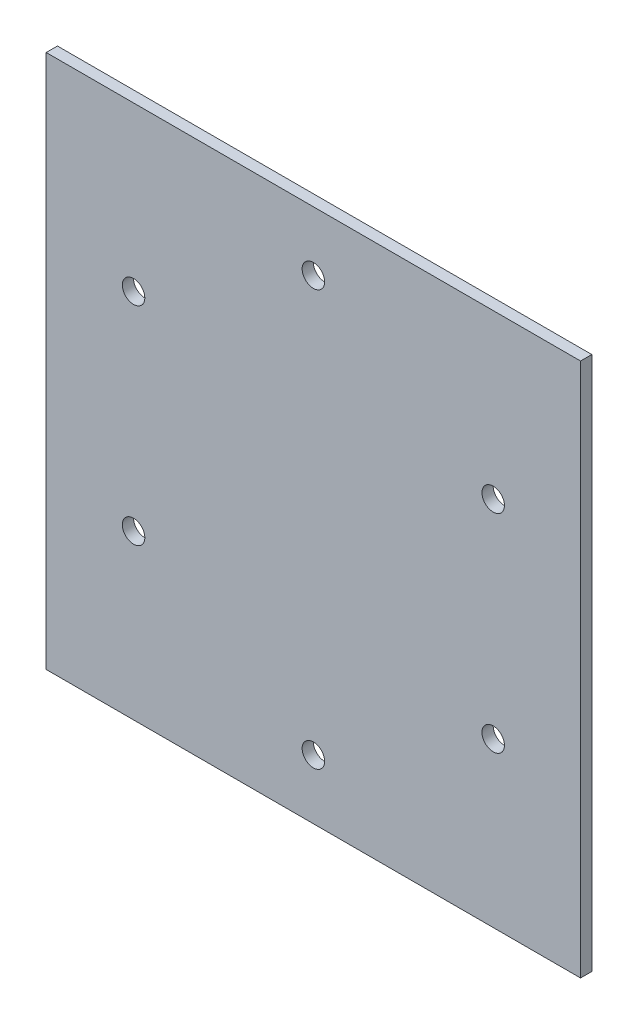
ISO-10303-21;
HEADER;
FILE_DESCRIPTION(('STEP AP214'),'2;1');
FILE_NAME('part.step','',(''),(''),'','','');
FILE_SCHEMA(('AUTOMOTIVE_DESIGN { 1 0 10303 214 1 1 1 1 }'));
ENDSEC;
DATA;
#1=APPLICATION_CONTEXT('core data for automotive mechanical design processes');
#2=APPLICATION_PROTOCOL_DEFINITION('international standard','automotive_design',2000,#1);
#3=PRODUCT_CONTEXT('',#1,'mechanical');
#4=PRODUCT('Part','Part','',(#3));
#5=PRODUCT_RELATED_PRODUCT_CATEGORY('part','',(#4));
#6=PRODUCT_DEFINITION_FORMATION('','',#4);
#7=PRODUCT_DEFINITION_CONTEXT('part definition',#1,'design');
#8=PRODUCT_DEFINITION('design','',#6,#7);
#9=PRODUCT_DEFINITION_SHAPE('','',#8);
#10=(LENGTH_UNIT() NAMED_UNIT(*) SI_UNIT(.MILLI.,.METRE.));
#11=(NAMED_UNIT(*) PLANE_ANGLE_UNIT() SI_UNIT($,.RADIAN.));
#12=(NAMED_UNIT(*) SI_UNIT($,.STERADIAN.) SOLID_ANGLE_UNIT());
#13=UNCERTAINTY_MEASURE_WITH_UNIT(LENGTH_MEASURE(1.E-05),#10,'distance_accuracy_value','');
#14=(GEOMETRIC_REPRESENTATION_CONTEXT(3) GLOBAL_UNCERTAINTY_ASSIGNED_CONTEXT((#13)) GLOBAL_UNIT_ASSIGNED_CONTEXT((#10,
#11,#12)) REPRESENTATION_CONTEXT('',''));
#15=CARTESIAN_POINT('',(0.,0.,0.));
#16=DIRECTION('',(0.,0.,1.));
#17=DIRECTION('',(1.,0.,0.));
#18=AXIS2_PLACEMENT_3D('',#15,#16,#17);
#19=CARTESIAN_POINT('',(0.,0.,2.));
#20=DIRECTION('',(1.,0.,0.));
#21=DIRECTION('',(0.,0.,-1.));
#22=AXIS2_PLACEMENT_3D('',#19,#20,#21);
#23=PLANE('',#22);
#24=DIRECTION('',(0.,-1.,0.));
#25=VECTOR('',#24,1.);
#26=CARTESIAN_POINT('',(0.,0.,-2.));
#27=LINE('',#26,#25);
#28=CARTESIAN_POINT('',(0.,190.,-2.));
#29=VERTEX_POINT('',#28);
#30=CARTESIAN_POINT('',(0.,0.,-2.));
#31=VERTEX_POINT('',#30);
#32=EDGE_CURVE('E102',#29,#31,#27,.T.);
#33=ORIENTED_EDGE('',*,*,#32,.T.);
#34=DIRECTION('',(0.,0.,-1.));
#35=VECTOR('',#34,1.);
#36=CARTESIAN_POINT('',(0.,0.,2.));
#37=LINE('',#36,#35);
#38=CARTESIAN_POINT('',(0.,0.,2.));
#39=VERTEX_POINT('',#38);
#40=EDGE_CURVE('E11',#39,#31,#37,.T.);
#41=ORIENTED_EDGE('',*,*,#40,.F.);
#42=DIRECTION('',(0.,-1.,0.));
#43=VECTOR('',#42,1.);
#44=CARTESIAN_POINT('',(0.,0.,2.));
#45=LINE('',#44,#43);
#46=CARTESIAN_POINT('',(0.,190.,2.));
#47=VERTEX_POINT('',#46);
#48=EDGE_CURVE('E90',#47,#39,#45,.T.);
#49=ORIENTED_EDGE('',*,*,#48,.F.);
#50=DIRECTION('',(0.,0.,-1.));
#51=VECTOR('',#50,1.);
#52=CARTESIAN_POINT('',(0.,190.,2.));
#53=LINE('',#52,#51);
#54=EDGE_CURVE('E98',#47,#29,#53,.T.);
#55=ORIENTED_EDGE('',*,*,#54,.T.);
#56=EDGE_LOOP('',(#33,#41,#49,#55));
#57=FACE_BOUND('',#56,.T.);
#58=ADVANCED_FACE('F39',(#57),#23,.F.);
#59=CARTESIAN_POINT('',(0.,0.,2.));
#60=DIRECTION('',(0.,1.,0.));
#61=DIRECTION('',(0.,0.,1.));
#62=AXIS2_PLACEMENT_3D('',#59,#60,#61);
#63=PLANE('',#62);
#64=DIRECTION('',(1.,0.,0.));
#65=VECTOR('',#64,1.);
#66=CARTESIAN_POINT('',(0.,0.,-2.));
#67=LINE('',#66,#65);
#68=CARTESIAN_POINT('',(190.,0.,-2.));
#69=VERTEX_POINT('',#68);
#70=EDGE_CURVE('E94',#31,#69,#67,.T.);
#71=ORIENTED_EDGE('',*,*,#70,.T.);
#72=DIRECTION('',(0.,0.,-1.));
#73=VECTOR('',#72,1.);
#74=CARTESIAN_POINT('',(190.,0.,2.));
#75=LINE('',#74,#73);
#76=CARTESIAN_POINT('',(190.,0.,2.));
#77=VERTEX_POINT('',#76);
#78=EDGE_CURVE('E47',#77,#69,#75,.T.);
#79=ORIENTED_EDGE('',*,*,#78,.F.);
#80=DIRECTION('',(1.,0.,0.));
#81=VECTOR('',#80,1.);
#82=CARTESIAN_POINT('',(0.,0.,2.));
#83=LINE('',#82,#81);
#84=EDGE_CURVE('E85',#39,#77,#83,.T.);
#85=ORIENTED_EDGE('',*,*,#84,.F.);
#86=ORIENTED_EDGE('',*,*,#40,.T.);
#87=EDGE_LOOP('',(#71,#79,#85,#86));
#88=FACE_BOUND('',#87,.T.);
#89=ADVANCED_FACE('F93',(#88),#63,.F.);
#90=CARTESIAN_POINT('',(190.,0.,2.));
#91=DIRECTION('',(-1.,0.,0.));
#92=DIRECTION('',(0.,0.,1.));
#93=AXIS2_PLACEMENT_3D('',#90,#91,#92);
#94=PLANE('',#93);
#95=DIRECTION('',(0.,1.,0.));
#96=VECTOR('',#95,1.);
#97=CARTESIAN_POINT('',(190.,0.,-2.));
#98=LINE('',#97,#96);
#99=CARTESIAN_POINT('',(190.,190.,-2.));
#100=VERTEX_POINT('',#99);
#101=EDGE_CURVE('E72',#69,#100,#98,.T.);
#102=ORIENTED_EDGE('',*,*,#101,.T.);
#103=DIRECTION('',(0.,0.,-1.));
#104=VECTOR('',#103,1.);
#105=CARTESIAN_POINT('',(190.,190.,2.));
#106=LINE('',#105,#104);
#107=CARTESIAN_POINT('',(190.,190.,2.));
#108=VERTEX_POINT('',#107);
#109=EDGE_CURVE('E95',#108,#100,#106,.T.);
#110=ORIENTED_EDGE('',*,*,#109,.F.);
#111=DIRECTION('',(0.,1.,0.));
#112=VECTOR('',#111,1.);
#113=CARTESIAN_POINT('',(190.,0.,2.));
#114=LINE('',#113,#112);
#115=EDGE_CURVE('E88',#77,#108,#114,.T.);
#116=ORIENTED_EDGE('',*,*,#115,.F.);
#117=ORIENTED_EDGE('',*,*,#78,.T.);
#118=EDGE_LOOP('',(#102,#110,#116,#117));
#119=FACE_BOUND('',#118,.T.);
#120=ADVANCED_FACE('F96',(#119),#94,.F.);
#121=CARTESIAN_POINT('',(0.,190.,2.));
#122=DIRECTION('',(0.,-1.,0.));
#123=DIRECTION('',(0.,0.,-1.));
#124=AXIS2_PLACEMENT_3D('',#121,#122,#123);
#125=PLANE('',#124);
#126=DIRECTION('',(-1.,0.,0.));
#127=VECTOR('',#126,1.);
#128=CARTESIAN_POINT('',(0.,190.,-2.));
#129=LINE('',#128,#127);
#130=EDGE_CURVE('E78',#100,#29,#129,.T.);
#131=ORIENTED_EDGE('',*,*,#130,.T.);
#132=ORIENTED_EDGE('',*,*,#54,.F.);
#133=DIRECTION('',(-1.,0.,0.));
#134=VECTOR('',#133,1.);
#135=CARTESIAN_POINT('',(0.,190.,2.));
#136=LINE('',#135,#134);
#137=EDGE_CURVE('E55',#108,#47,#136,.T.);
#138=ORIENTED_EDGE('',*,*,#137,.F.);
#139=ORIENTED_EDGE('',*,*,#109,.T.);
#140=EDGE_LOOP('',(#131,#132,#138,#139));
#141=FACE_BOUND('',#140,.T.);
#142=ADVANCED_FACE('F110',(#141),#125,.F.);
#143=CARTESIAN_POINT('',(0.,0.,2.));
#144=DIRECTION('',(0.,0.,-1.));
#145=DIRECTION('',(-1.,0.,0.));
#146=AXIS2_PLACEMENT_3D('',#143,#144,#145);
#147=PLANE('',#146);
#148=CARTESIAN_POINT('',(95.,168.86,2.));
#149=DIRECTION('',(0.,0.,1.));
#150=DIRECTION('',(1.,0.,0.));
#151=AXIS2_PLACEMENT_3D('',#148,#149,#150);
#152=CIRCLE('',#151,4.00000000000001);
#153=CARTESIAN_POINT('',(99.,168.86,2.));
#154=VERTEX_POINT('',#153);
#155=EDGE_CURVE('E141',#154,#154,#152,.T.);
#156=ORIENTED_EDGE('',*,*,#155,.F.);
#157=EDGE_LOOP('',(#156));
#158=FACE_BOUND('',#157,.T.);
#159=CARTESIAN_POINT('',(31.0613444385962,131.944999999999,2.));
#160=DIRECTION('',(0.,0.,1.));
#161=DIRECTION('',(1.,0.,0.));
#162=AXIS2_PLACEMENT_3D('',#159,#160,#161);
#163=CIRCLE('',#162,4.00000000000001);
#164=CARTESIAN_POINT('',(35.0613444385962,131.944999999999,2.));
#165=VERTEX_POINT('',#164);
#166=EDGE_CURVE('E120',#165,#165,#163,.T.);
#167=ORIENTED_EDGE('',*,*,#166,.F.);
#168=EDGE_LOOP('',(#167));
#169=FACE_BOUND('',#168,.T.);
#170=CARTESIAN_POINT('',(31.0613444385973,58.114999999999,2.));
#171=DIRECTION('',(0.,0.,1.));
#172=DIRECTION('',(1.,0.,0.));
#173=AXIS2_PLACEMENT_3D('',#170,#171,#172);
#174=CIRCLE('',#173,4.);
#175=CARTESIAN_POINT('',(35.0613444385973,58.114999999999,2.));
#176=VERTEX_POINT('',#175);
#177=EDGE_CURVE('E119',#176,#176,#174,.T.);
#178=ORIENTED_EDGE('',*,*,#177,.F.);
#179=EDGE_LOOP('',(#178));
#180=FACE_BOUND('',#179,.T.);
#181=CARTESIAN_POINT('',(95.0000000000031,21.2,2.));
#182=DIRECTION('',(0.,0.,1.));
#183=DIRECTION('',(1.,0.,0.));
#184=AXIS2_PLACEMENT_3D('',#181,#182,#183);
#185=CIRCLE('',#184,4.00000000000001);
#186=CARTESIAN_POINT('',(99.0000000000031,21.2,2.));
#187=VERTEX_POINT('',#186);
#188=EDGE_CURVE('E126',#187,#187,#185,.T.);
#189=ORIENTED_EDGE('',*,*,#188,.F.);
#190=EDGE_LOOP('',(#189));
#191=FACE_BOUND('',#190,.T.);
#192=CARTESIAN_POINT('',(158.938655561408,58.1150000000012,2.));
#193=DIRECTION('',(0.,0.,1.));
#194=DIRECTION('',(1.,0.,0.));
#195=AXIS2_PLACEMENT_3D('',#192,#193,#194);
#196=CIRCLE('',#195,4.);
#197=CARTESIAN_POINT('',(162.938655561408,58.1150000000012,2.));
#198=VERTEX_POINT('',#197);
#199=EDGE_CURVE('E132',#198,#198,#196,.T.);
#200=ORIENTED_EDGE('',*,*,#199,.F.);
#201=EDGE_LOOP('',(#200));
#202=FACE_BOUND('',#201,.T.);
#203=CARTESIAN_POINT('',(158.938655561406,131.945000000001,2.));
#204=DIRECTION('',(0.,0.,1.));
#205=DIRECTION('',(1.,0.,0.));
#206=AXIS2_PLACEMENT_3D('',#203,#204,#205);
#207=CIRCLE('',#206,3.99999999999999);
#208=CARTESIAN_POINT('',(162.938655561406,131.945000000001,2.));
#209=VERTEX_POINT('',#208);
#210=EDGE_CURVE('E138',#209,#209,#207,.T.);
#211=ORIENTED_EDGE('',*,*,#210,.F.);
#212=EDGE_LOOP('',(#211));
#213=FACE_BOUND('',#212,.T.);
#214=ORIENTED_EDGE('',*,*,#48,.T.);
#215=ORIENTED_EDGE('',*,*,#84,.T.);
#216=ORIENTED_EDGE('',*,*,#115,.T.);
#217=ORIENTED_EDGE('',*,*,#137,.T.);
#218=EDGE_LOOP('',(#214,#215,#216,#217));
#219=FACE_BOUND('',#218,.T.);
#220=ADVANCED_FACE('F86',(#158,#169,#180,#191,#202,#213,#219),#147,.F.);
#221=CARTESIAN_POINT('',(0.,0.,-2.));
#222=DIRECTION('',(0.,0.,-1.));
#223=DIRECTION('',(-1.,0.,0.));
#224=AXIS2_PLACEMENT_3D('',#221,#222,#223);
#225=PLANE('',#224);
#226=CARTESIAN_POINT('',(95.,168.86,-2.));
#227=DIRECTION('',(0.,0.,1.));
#228=DIRECTION('',(1.,0.,0.));
#229=AXIS2_PLACEMENT_3D('',#226,#227,#228);
#230=CIRCLE('',#229,4.00000000000001);
#231=CARTESIAN_POINT('',(99.,168.86,-2.));
#232=VERTEX_POINT('',#231);
#233=EDGE_CURVE('E105',#232,#232,#230,.T.);
#234=ORIENTED_EDGE('',*,*,#233,.T.);
#235=EDGE_LOOP('',(#234));
#236=FACE_BOUND('',#235,.T.);
#237=CARTESIAN_POINT('',(31.0613444385962,131.944999999999,-2.));
#238=DIRECTION('',(0.,0.,1.));
#239=DIRECTION('',(1.,0.,0.));
#240=AXIS2_PLACEMENT_3D('',#237,#238,#239);
#241=CIRCLE('',#240,4.00000000000001);
#242=CARTESIAN_POINT('',(35.0613444385962,131.944999999999,-2.));
#243=VERTEX_POINT('',#242);
#244=EDGE_CURVE('E142',#243,#243,#241,.T.);
#245=ORIENTED_EDGE('',*,*,#244,.T.);
#246=EDGE_LOOP('',(#245));
#247=FACE_BOUND('',#246,.T.);
#248=CARTESIAN_POINT('',(31.0613444385973,58.114999999999,-2.));
#249=DIRECTION('',(0.,0.,1.));
#250=DIRECTION('',(1.,0.,0.));
#251=AXIS2_PLACEMENT_3D('',#248,#249,#250);
#252=CIRCLE('',#251,4.);
#253=CARTESIAN_POINT('',(35.0613444385973,58.114999999999,-2.));
#254=VERTEX_POINT('',#253);
#255=EDGE_CURVE('E116',#254,#254,#252,.T.);
#256=ORIENTED_EDGE('',*,*,#255,.T.);
#257=EDGE_LOOP('',(#256));
#258=FACE_BOUND('',#257,.T.);
#259=CARTESIAN_POINT('',(95.0000000000031,21.2,-2.));
#260=DIRECTION('',(0.,0.,1.));
#261=DIRECTION('',(1.,0.,0.));
#262=AXIS2_PLACEMENT_3D('',#259,#260,#261);
#263=CIRCLE('',#262,4.00000000000001);
#264=CARTESIAN_POINT('',(99.0000000000031,21.2,-2.));
#265=VERTEX_POINT('',#264);
#266=EDGE_CURVE('E123',#265,#265,#263,.T.);
#267=ORIENTED_EDGE('',*,*,#266,.T.);
#268=EDGE_LOOP('',(#267));
#269=FACE_BOUND('',#268,.T.);
#270=CARTESIAN_POINT('',(158.938655561408,58.1150000000012,-2.));
#271=DIRECTION('',(0.,0.,1.));
#272=DIRECTION('',(1.,0.,0.));
#273=AXIS2_PLACEMENT_3D('',#270,#271,#272);
#274=CIRCLE('',#273,4.);
#275=CARTESIAN_POINT('',(162.938655561408,58.1150000000012,-2.));
#276=VERTEX_POINT('',#275);
#277=EDGE_CURVE('E129',#276,#276,#274,.T.);
#278=ORIENTED_EDGE('',*,*,#277,.T.);
#279=EDGE_LOOP('',(#278));
#280=FACE_BOUND('',#279,.T.);
#281=CARTESIAN_POINT('',(158.938655561406,131.945000000001,-2.));
#282=DIRECTION('',(0.,0.,1.));
#283=DIRECTION('',(1.,0.,0.));
#284=AXIS2_PLACEMENT_3D('',#281,#282,#283);
#285=CIRCLE('',#284,3.99999999999999);
#286=CARTESIAN_POINT('',(162.938655561406,131.945000000001,-2.));
#287=VERTEX_POINT('',#286);
#288=EDGE_CURVE('E135',#287,#287,#285,.T.);
#289=ORIENTED_EDGE('',*,*,#288,.T.);
#290=EDGE_LOOP('',(#289));
#291=FACE_BOUND('',#290,.T.);
#292=ORIENTED_EDGE('',*,*,#32,.F.);
#293=ORIENTED_EDGE('',*,*,#130,.F.);
#294=ORIENTED_EDGE('',*,*,#101,.F.);
#295=ORIENTED_EDGE('',*,*,#70,.F.);
#296=EDGE_LOOP('',(#292,#293,#294,#295));
#297=FACE_BOUND('',#296,.T.);
#298=ADVANCED_FACE('F113',(#236,#247,#258,#269,#280,#291,#297),#225,.T.);
#299=CARTESIAN_POINT('',(158.938655561406,131.945000000001,-2.));
#300=DIRECTION('',(0.,0.,1.));
#301=DIRECTION('',(1.,0.,0.));
#302=AXIS2_PLACEMENT_3D('',#299,#300,#301);
#303=CYLINDRICAL_SURFACE('',#302,3.99999999999999);
#304=ORIENTED_EDGE('',*,*,#288,.F.);
#305=EDGE_LOOP('',(#304));
#306=FACE_BOUND('',#305,.T.);
#307=ORIENTED_EDGE('',*,*,#210,.T.);
#308=EDGE_LOOP('',(#307));
#309=FACE_BOUND('',#308,.T.);
#310=ADVANCED_FACE('F174',(#306,#309),#303,.F.);
#311=CARTESIAN_POINT('',(158.938655561408,58.1150000000012,-2.));
#312=DIRECTION('',(0.,0.,1.));
#313=DIRECTION('',(1.,0.,0.));
#314=AXIS2_PLACEMENT_3D('',#311,#312,#313);
#315=CYLINDRICAL_SURFACE('',#314,4.);
#316=ORIENTED_EDGE('',*,*,#277,.F.);
#317=EDGE_LOOP('',(#316));
#318=FACE_BOUND('',#317,.T.);
#319=ORIENTED_EDGE('',*,*,#199,.T.);
#320=EDGE_LOOP('',(#319));
#321=FACE_BOUND('',#320,.T.);
#322=ADVANCED_FACE('F176',(#318,#321),#315,.F.);
#323=CARTESIAN_POINT('',(95.0000000000031,21.2,-2.));
#324=DIRECTION('',(0.,0.,1.));
#325=DIRECTION('',(1.,0.,0.));
#326=AXIS2_PLACEMENT_3D('',#323,#324,#325);
#327=CYLINDRICAL_SURFACE('',#326,4.00000000000001);
#328=ORIENTED_EDGE('',*,*,#266,.F.);
#329=EDGE_LOOP('',(#328));
#330=FACE_BOUND('',#329,.T.);
#331=ORIENTED_EDGE('',*,*,#188,.T.);
#332=EDGE_LOOP('',(#331));
#333=FACE_BOUND('',#332,.T.);
#334=ADVANCED_FACE('F183',(#330,#333),#327,.F.);
#335=CARTESIAN_POINT('',(31.0613444385973,58.114999999999,-2.));
#336=DIRECTION('',(0.,0.,1.));
#337=DIRECTION('',(1.,0.,0.));
#338=AXIS2_PLACEMENT_3D('',#335,#336,#337);
#339=CYLINDRICAL_SURFACE('',#338,4.);
#340=ORIENTED_EDGE('',*,*,#255,.F.);
#341=EDGE_LOOP('',(#340));
#342=FACE_BOUND('',#341,.T.);
#343=ORIENTED_EDGE('',*,*,#177,.T.);
#344=EDGE_LOOP('',(#343));
#345=FACE_BOUND('',#344,.T.);
#346=ADVANCED_FACE('F200',(#342,#345),#339,.F.);
#347=CARTESIAN_POINT('',(31.0613444385962,131.944999999999,-2.));
#348=DIRECTION('',(0.,0.,1.));
#349=DIRECTION('',(1.,0.,0.));
#350=AXIS2_PLACEMENT_3D('',#347,#348,#349);
#351=CYLINDRICAL_SURFACE('',#350,4.00000000000001);
#352=ORIENTED_EDGE('',*,*,#244,.F.);
#353=EDGE_LOOP('',(#352));
#354=FACE_BOUND('',#353,.T.);
#355=ORIENTED_EDGE('',*,*,#166,.T.);
#356=EDGE_LOOP('',(#355));
#357=FACE_BOUND('',#356,.T.);
#358=ADVANCED_FACE('F157',(#354,#357),#351,.F.);
#359=CARTESIAN_POINT('',(95.,168.86,-2.));
#360=DIRECTION('',(0.,0.,1.));
#361=DIRECTION('',(1.,0.,0.));
#362=AXIS2_PLACEMENT_3D('',#359,#360,#361);
#363=CYLINDRICAL_SURFACE('',#362,4.00000000000001);
#364=ORIENTED_EDGE('',*,*,#233,.F.);
#365=EDGE_LOOP('',(#364));
#366=FACE_BOUND('',#365,.T.);
#367=ORIENTED_EDGE('',*,*,#155,.T.);
#368=EDGE_LOOP('',(#367));
#369=FACE_BOUND('',#368,.T.);
#370=ADVANCED_FACE('F154',(#366,#369),#363,.F.);
#371=CLOSED_SHELL('',(#58,#89,#120,#142,#220,#298,#310,#322,#334,#346,#358,#370));
#372=MANIFOLD_SOLID_BREP('B2',#371);
#373=ADVANCED_BREP_SHAPE_REPRESENTATION('',(#18,#372),#14);
#374=SHAPE_DEFINITION_REPRESENTATION(#9,#373);
ENDSEC;
END-ISO-10303-21;
